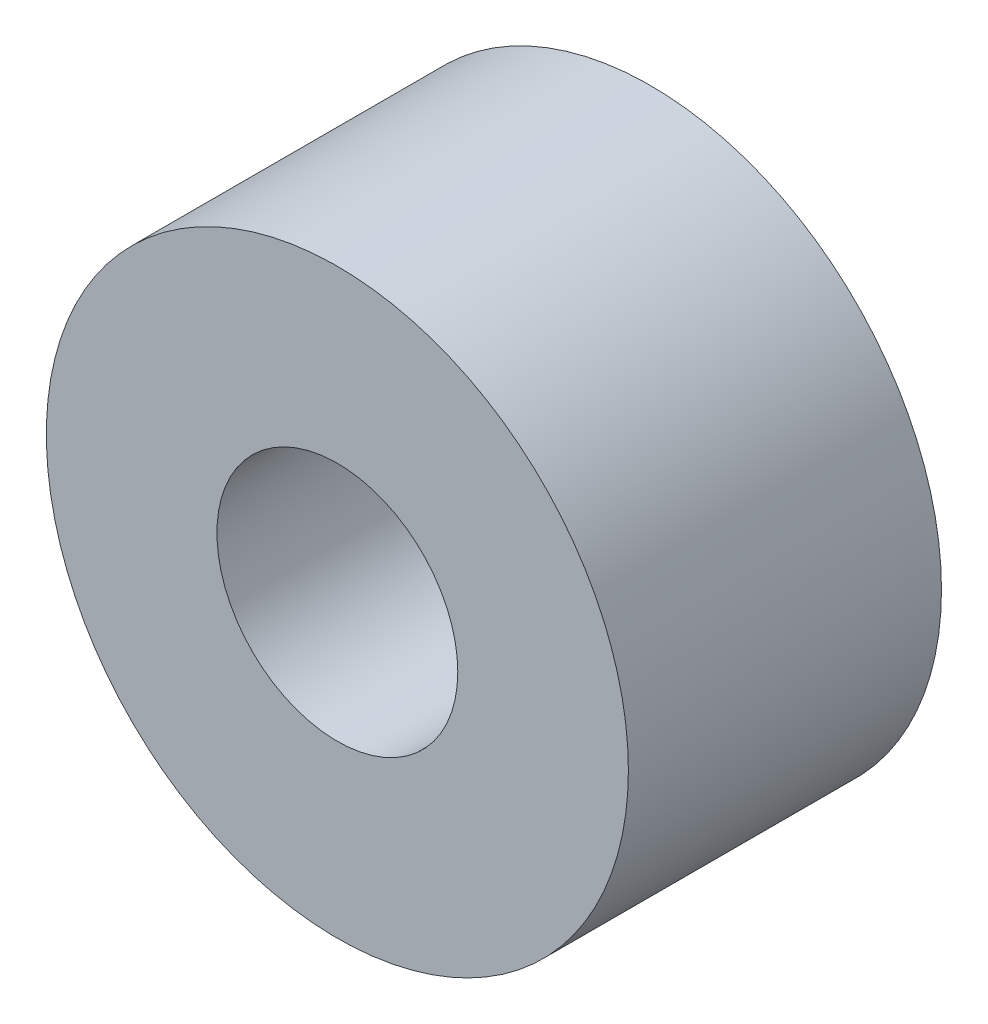
ISO-10303-21;
HEADER;
FILE_DESCRIPTION(('STEP AP214'),'2;1');
FILE_NAME('part.step','',(''),(''),'','','');
FILE_SCHEMA(('AUTOMOTIVE_DESIGN { 1 0 10303 214 1 1 1 1 }'));
ENDSEC;
DATA;
#1=APPLICATION_CONTEXT('core data for automotive mechanical design processes');
#2=APPLICATION_PROTOCOL_DEFINITION('international standard','automotive_design',2000,#1);
#3=PRODUCT_CONTEXT('',#1,'mechanical');
#4=PRODUCT('Part','Part','',(#3));
#5=PRODUCT_RELATED_PRODUCT_CATEGORY('part','',(#4));
#6=PRODUCT_DEFINITION_FORMATION('','',#4);
#7=PRODUCT_DEFINITION_CONTEXT('part definition',#1,'design');
#8=PRODUCT_DEFINITION('design','',#6,#7);
#9=PRODUCT_DEFINITION_SHAPE('','',#8);
#10=(LENGTH_UNIT() NAMED_UNIT(*) SI_UNIT(.MILLI.,.METRE.));
#11=(NAMED_UNIT(*) PLANE_ANGLE_UNIT() SI_UNIT($,.RADIAN.));
#12=(NAMED_UNIT(*) SI_UNIT($,.STERADIAN.) SOLID_ANGLE_UNIT());
#13=UNCERTAINTY_MEASURE_WITH_UNIT(LENGTH_MEASURE(1.E-05),#10,'distance_accuracy_value','');
#14=(GEOMETRIC_REPRESENTATION_CONTEXT(3) GLOBAL_UNCERTAINTY_ASSIGNED_CONTEXT((#13)) GLOBAL_UNIT_ASSIGNED_CONTEXT((#10,
#11,#12)) REPRESENTATION_CONTEXT('',''));
#15=CARTESIAN_POINT('',(0.,0.,0.));
#16=DIRECTION('',(0.,0.,1.));
#17=DIRECTION('',(1.,0.,0.));
#18=AXIS2_PLACEMENT_3D('',#15,#16,#17);
#19=CARTESIAN_POINT('',(0.,0.,0.));
#20=DIRECTION('',(0.,0.,1.));
#21=DIRECTION('',(1.,0.,0.));
#22=AXIS2_PLACEMENT_3D('',#19,#20,#21);
#23=CYLINDRICAL_SURFACE('',#22,3.);
#24=CARTESIAN_POINT('',(0.,0.,0.));
#25=DIRECTION('',(0.,0.,1.));
#26=DIRECTION('',(1.,0.,0.));
#27=AXIS2_PLACEMENT_3D('',#24,#25,#26);
#28=CIRCLE('',#27,3.);
#29=CARTESIAN_POINT('',(3.,0.,0.));
#30=VERTEX_POINT('',#29);
#31=EDGE_CURVE('E27',#30,#30,#28,.T.);
#32=ORIENTED_EDGE('',*,*,#31,.F.);
#33=EDGE_LOOP('',(#32));
#34=FACE_BOUND('',#33,.T.);
#35=CARTESIAN_POINT('',(0.,0.,7.8));
#36=DIRECTION('',(0.,0.,1.));
#37=DIRECTION('',(1.,0.,0.));
#38=AXIS2_PLACEMENT_3D('',#35,#36,#37);
#39=CIRCLE('',#38,3.);
#40=CARTESIAN_POINT('',(3.,0.,7.8));
#41=VERTEX_POINT('',#40);
#42=EDGE_CURVE('E18',#41,#41,#39,.T.);
#43=ORIENTED_EDGE('',*,*,#42,.T.);
#44=EDGE_LOOP('',(#43));
#45=FACE_BOUND('',#44,.T.);
#46=ADVANCED_FACE('F15',(#34,#45),#23,.F.);
#47=CARTESIAN_POINT('',(0.,0.,7.8));
#48=DIRECTION('',(0.,0.,-1.));
#49=DIRECTION('',(-1.,0.,0.));
#50=AXIS2_PLACEMENT_3D('',#47,#48,#49);
#51=PLANE('',#50);
#52=ORIENTED_EDGE('',*,*,#42,.F.);
#53=EDGE_LOOP('',(#52));
#54=FACE_BOUND('',#53,.T.);
#55=CARTESIAN_POINT('',(0.,0.,7.8));
#56=DIRECTION('',(0.,0.,1.));
#57=DIRECTION('',(1.,0.,0.));
#58=AXIS2_PLACEMENT_3D('',#55,#56,#57);
#59=CIRCLE('',#58,7.25);
#60=CARTESIAN_POINT('',(7.25,0.,7.8));
#61=VERTEX_POINT('',#60);
#62=EDGE_CURVE('E22',#61,#61,#59,.F.);
#63=ORIENTED_EDGE('',*,*,#62,.F.);
#64=EDGE_LOOP('',(#63));
#65=FACE_BOUND('',#64,.T.);
#66=ADVANCED_FACE('F36',(#54,#65),#51,.F.);
#67=CARTESIAN_POINT('',(0.,0.,0.));
#68=DIRECTION('',(0.,0.,-1.));
#69=DIRECTION('',(-1.,0.,0.));
#70=AXIS2_PLACEMENT_3D('',#67,#68,#69);
#71=PLANE('',#70);
#72=ORIENTED_EDGE('',*,*,#31,.T.);
#73=EDGE_LOOP('',(#72));
#74=FACE_BOUND('',#73,.T.);
#75=CARTESIAN_POINT('',(0.,0.,0.));
#76=DIRECTION('',(0.,0.,1.));
#77=DIRECTION('',(1.,0.,0.));
#78=AXIS2_PLACEMENT_3D('',#75,#76,#77);
#79=CIRCLE('',#78,7.25);
#80=CARTESIAN_POINT('',(7.25,0.,0.));
#81=VERTEX_POINT('',#80);
#82=EDGE_CURVE('E10',#81,#81,#79,.T.);
#83=ORIENTED_EDGE('',*,*,#82,.F.);
#84=EDGE_LOOP('',(#83));
#85=FACE_BOUND('',#84,.T.);
#86=ADVANCED_FACE('F39',(#74,#85),#71,.T.);
#87=CARTESIAN_POINT('',(0.,0.,0.));
#88=DIRECTION('',(0.,0.,1.));
#89=DIRECTION('',(1.,0.,0.));
#90=AXIS2_PLACEMENT_3D('',#87,#88,#89);
#91=CYLINDRICAL_SURFACE('',#90,7.25);
#92=ORIENTED_EDGE('',*,*,#82,.T.);
#93=EDGE_LOOP('',(#92));
#94=FACE_BOUND('',#93,.T.);
#95=ORIENTED_EDGE('',*,*,#62,.T.);
#96=EDGE_LOOP('',(#95));
#97=FACE_BOUND('',#96,.T.);
#98=ADVANCED_FACE('F42',(#94,#97),#91,.T.);
#99=CLOSED_SHELL('',(#46,#66,#86,#98));
#100=MANIFOLD_SOLID_BREP('B1',#99);
#101=ADVANCED_BREP_SHAPE_REPRESENTATION('',(#18,#100),#14);
#102=SHAPE_DEFINITION_REPRESENTATION(#9,#101);
ENDSEC;
END-ISO-10303-21;
